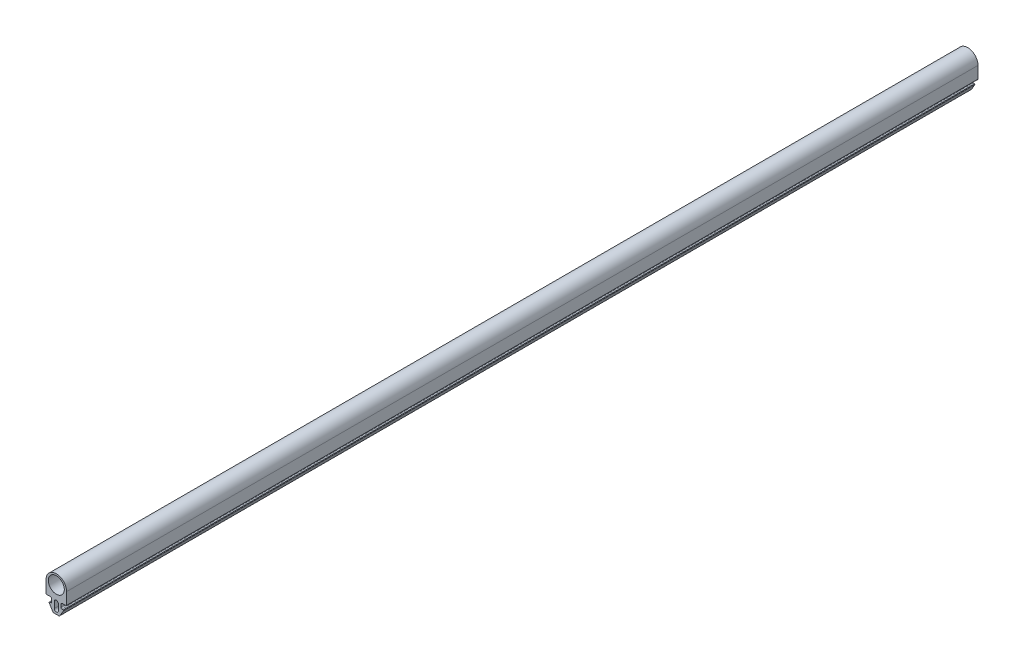
ISO-10303-21;
HEADER;
FILE_DESCRIPTION(('STEP AP214'),'2;1');
FILE_NAME('part.step','',(''),(''),'','','');
FILE_SCHEMA(('AUTOMOTIVE_DESIGN { 1 0 10303 214 1 1 1 1 }'));
ENDSEC;
DATA;
#1=APPLICATION_CONTEXT('core data for automotive mechanical design processes');
#2=APPLICATION_PROTOCOL_DEFINITION('international standard','automotive_design',2000,#1);
#3=PRODUCT_CONTEXT('',#1,'mechanical');
#4=PRODUCT('Part','Part','',(#3));
#5=PRODUCT_RELATED_PRODUCT_CATEGORY('part','',(#4));
#6=PRODUCT_DEFINITION_FORMATION('','',#4);
#7=PRODUCT_DEFINITION_CONTEXT('part definition',#1,'design');
#8=PRODUCT_DEFINITION('design','',#6,#7);
#9=PRODUCT_DEFINITION_SHAPE('','',#8);
#10=(LENGTH_UNIT() NAMED_UNIT(*) SI_UNIT(.MILLI.,.METRE.));
#11=(NAMED_UNIT(*) PLANE_ANGLE_UNIT() SI_UNIT($,.RADIAN.));
#12=(NAMED_UNIT(*) SI_UNIT($,.STERADIAN.) SOLID_ANGLE_UNIT());
#13=UNCERTAINTY_MEASURE_WITH_UNIT(LENGTH_MEASURE(1.E-05),#10,'distance_accuracy_value','');
#14=(GEOMETRIC_REPRESENTATION_CONTEXT(3) GLOBAL_UNCERTAINTY_ASSIGNED_CONTEXT((#13)) GLOBAL_UNIT_ASSIGNED_CONTEXT((#10,
#11,#12)) REPRESENTATION_CONTEXT('',''));
#15=CARTESIAN_POINT('',(0.,0.,0.));
#16=DIRECTION('',(0.,0.,1.));
#17=DIRECTION('',(1.,0.,0.));
#18=AXIS2_PLACEMENT_3D('',#15,#16,#17);
#19=CARTESIAN_POINT('',(1.89605275924265E-12,10.8645868639071,-776.));
#20=DIRECTION('',(0.,0.,1.));
#21=DIRECTION('',(1.,0.,0.));
#22=AXIS2_PLACEMENT_3D('',#19,#20,#21);
#23=CYLINDRICAL_SURFACE('',#22,8.99999999999883);
#24=CARTESIAN_POINT('',(1.89605275924265E-12,10.8645868639071,20.));
#25=DIRECTION('',(0.,0.,1.));
#26=DIRECTION('',(1.,0.,0.));
#27=AXIS2_PLACEMENT_3D('',#24,#25,#26);
#28=CIRCLE('',#27,8.99999999999883);
#29=CARTESIAN_POINT('',(9.00000000000078,10.8645868639071,20.));
#30=VERTEX_POINT('',#29);
#31=CARTESIAN_POINT('',(-8.99999999999688,10.8645868639071,20.));
#32=VERTEX_POINT('',#31);
#33=EDGE_CURVE('E245',#30,#32,#28,.T.);
#34=ORIENTED_EDGE('',*,*,#33,.F.);
#35=DIRECTION('',(0.,0.,1.));
#36=VECTOR('',#35,1.);
#37=CARTESIAN_POINT('',(9.00000000000078,10.8645868639071,-776.));
#38=LINE('',#37,#36);
#39=CARTESIAN_POINT('',(9.00000000000078,10.8645868639071,-776.));
#40=VERTEX_POINT('',#39);
#41=EDGE_CURVE('E11',#40,#30,#38,.T.);
#42=ORIENTED_EDGE('',*,*,#41,.F.);
#43=CARTESIAN_POINT('',(1.89605275924265E-12,10.8645868639071,-776.));
#44=DIRECTION('',(0.,0.,1.));
#45=DIRECTION('',(1.,0.,0.));
#46=AXIS2_PLACEMENT_3D('',#43,#44,#45);
#47=CIRCLE('',#46,8.99999999999883);
#48=CARTESIAN_POINT('',(-8.99999999999688,10.8645868639071,-776.));
#49=VERTEX_POINT('',#48);
#50=EDGE_CURVE('E249',#40,#49,#47,.T.);
#51=ORIENTED_EDGE('',*,*,#50,.T.);
#52=DIRECTION('',(0.,0.,1.));
#53=VECTOR('',#52,1.);
#54=CARTESIAN_POINT('',(-8.99999999999688,10.8645868639071,-776.));
#55=LINE('',#54,#53);
#56=EDGE_CURVE('E38',#49,#32,#55,.T.);
#57=ORIENTED_EDGE('',*,*,#56,.T.);
#58=EDGE_LOOP('',(#34,#42,#51,#57));
#59=FACE_BOUND('',#58,.T.);
#60=ADVANCED_FACE('F35',(#59),#23,.T.);
#61=CARTESIAN_POINT('',(9.00000000000088,0.52392483735149,-776.));
#62=DIRECTION('',(1.,0.,0.));
#63=DIRECTION('',(0.,1.,0.));
#64=AXIS2_PLACEMENT_3D('',#61,#62,#63);
#65=PLANE('',#64);
#66=DIRECTION('',(0.,1.,0.));
#67=VECTOR('',#66,1.);
#68=CARTESIAN_POINT('',(9.00000000000088,0.52392483735149,20.));
#69=LINE('',#68,#67);
#70=CARTESIAN_POINT('',(9.00000000000088,0.52392483735149,20.));
#71=VERTEX_POINT('',#70);
#72=EDGE_CURVE('E253',#71,#30,#69,.T.);
#73=ORIENTED_EDGE('',*,*,#72,.F.);
#74=DIRECTION('',(0.,0.,1.));
#75=VECTOR('',#74,1.);
#76=CARTESIAN_POINT('',(9.00000000000088,0.52392483735149,-776.));
#77=LINE('',#76,#75);
#78=CARTESIAN_POINT('',(9.00000000000088,0.52392483735149,-776.));
#79=VERTEX_POINT('',#78);
#80=EDGE_CURVE('E43',#79,#71,#77,.T.);
#81=ORIENTED_EDGE('',*,*,#80,.F.);
#82=DIRECTION('',(0.,1.,0.));
#83=VECTOR('',#82,1.);
#84=CARTESIAN_POINT('',(9.00000000000088,0.52392483735149,-776.));
#85=LINE('',#84,#83);
#86=EDGE_CURVE('E313',#79,#40,#85,.T.);
#87=ORIENTED_EDGE('',*,*,#86,.T.);
#88=ORIENTED_EDGE('',*,*,#41,.T.);
#89=EDGE_LOOP('',(#73,#81,#87,#88));
#90=FACE_BOUND('',#89,.T.);
#91=ADVANCED_FACE('F430',(#90),#65,.T.);
#92=CARTESIAN_POINT('',(8.50059730669664,0.499492278712887,-776.));
#93=DIRECTION('',(0.,0.,1.));
#94=DIRECTION('',(1.,0.,0.));
#95=AXIS2_PLACEMENT_3D('',#92,#93,#94);
#96=CYLINDRICAL_SURFACE('',#95,0.50000000000115);
#97=CARTESIAN_POINT('',(8.50059730669664,0.499492278712887,20.));
#98=DIRECTION('',(0.,0.,1.));
#99=DIRECTION('',(1.,0.,0.));
#100=AXIS2_PLACEMENT_3D('',#97,#98,#99);
#101=CIRCLE('',#100,0.50000000000115);
#102=CARTESIAN_POINT('',(8.47807035601008,-1.22623265708111E-13,20.));
#103=VERTEX_POINT('',#102);
#104=EDGE_CURVE('E375',#103,#71,#101,.T.);
#105=ORIENTED_EDGE('',*,*,#104,.F.);
#106=DIRECTION('',(0.,0.,1.));
#107=VECTOR('',#106,1.);
#108=CARTESIAN_POINT('',(8.47807035601008,-1.22623265708111E-13,-776.));
#109=LINE('',#108,#107);
#110=CARTESIAN_POINT('',(8.47807035601008,-1.22623265708111E-13,-776.));
#111=VERTEX_POINT('',#110);
#112=EDGE_CURVE('E381',#111,#103,#109,.T.);
#113=ORIENTED_EDGE('',*,*,#112,.F.);
#114=CARTESIAN_POINT('',(8.50059730669664,0.499492278712887,-776.));
#115=DIRECTION('',(0.,0.,1.));
#116=DIRECTION('',(1.,0.,0.));
#117=AXIS2_PLACEMENT_3D('',#114,#115,#116);
#118=CIRCLE('',#117,0.50000000000115);
#119=EDGE_CURVE('E310',#111,#79,#118,.T.);
#120=ORIENTED_EDGE('',*,*,#119,.T.);
#121=ORIENTED_EDGE('',*,*,#80,.T.);
#122=EDGE_LOOP('',(#105,#113,#120,#121));
#123=FACE_BOUND('',#122,.T.);
#124=ADVANCED_FACE('F505',(#123),#96,.T.);
#125=CARTESIAN_POINT('',(5.49999999999965,-1.15033850500712E-13,-776.));
#126=DIRECTION('',(0.,-1.,0.));
#127=DIRECTION('',(1.,0.,0.));
#128=AXIS2_PLACEMENT_3D('',#125,#126,#127);
#129=PLANE('',#128);
#130=DIRECTION('',(1.,0.,0.));
#131=VECTOR('',#130,1.);
#132=CARTESIAN_POINT('',(5.49999999999965,-1.15033850500712E-13,20.));
#133=LINE('',#132,#131);
#134=CARTESIAN_POINT('',(5.49999999999965,-1.15033850500712E-13,20.));
#135=VERTEX_POINT('',#134);
#136=EDGE_CURVE('E372',#135,#103,#133,.T.);
#137=ORIENTED_EDGE('',*,*,#136,.F.);
#138=DIRECTION('',(0.,0.,1.));
#139=VECTOR('',#138,1.);
#140=CARTESIAN_POINT('',(5.49999999999965,-1.15033850500712E-13,-776.));
#141=LINE('',#140,#139);
#142=CARTESIAN_POINT('',(5.49999999999965,-1.15033850500712E-13,-776.));
#143=VERTEX_POINT('',#142);
#144=EDGE_CURVE('E383',#143,#135,#141,.T.);
#145=ORIENTED_EDGE('',*,*,#144,.F.);
#146=DIRECTION('',(1.,0.,0.));
#147=VECTOR('',#146,1.);
#148=CARTESIAN_POINT('',(5.49999999999965,-1.15033850500712E-13,-776.));
#149=LINE('',#148,#147);
#150=EDGE_CURVE('E307',#143,#111,#149,.T.);
#151=ORIENTED_EDGE('',*,*,#150,.T.);
#152=ORIENTED_EDGE('',*,*,#112,.T.);
#153=EDGE_LOOP('',(#137,#145,#151,#152));
#154=FACE_BOUND('',#153,.T.);
#155=ADVANCED_FACE('F503',(#154),#129,.T.);
#156=CARTESIAN_POINT('',(5.49999999999963,-1.50000000000017,-776.));
#157=DIRECTION('',(0.,0.,1.));
#158=DIRECTION('',(1.,0.,0.));
#159=AXIS2_PLACEMENT_3D('',#156,#157,#158);
#160=CYLINDRICAL_SURFACE('',#159,1.50000000000001);
#161=CARTESIAN_POINT('',(5.49999999999963,-1.50000000000017,20.));
#162=DIRECTION('',(0.,0.,-1.));
#163=DIRECTION('',(-1.,0.,0.));
#164=AXIS2_PLACEMENT_3D('',#161,#162,#163);
#165=CIRCLE('',#164,1.50000000000001);
#166=CARTESIAN_POINT('',(3.99999999999962,-1.50000000000015,20.));
#167=VERTEX_POINT('',#166);
#168=EDGE_CURVE('E369',#167,#135,#165,.T.);
#169=ORIENTED_EDGE('',*,*,#168,.F.);
#170=DIRECTION('',(0.,0.,1.));
#171=VECTOR('',#170,1.);
#172=CARTESIAN_POINT('',(3.99999999999962,-1.50000000000015,-776.));
#173=LINE('',#172,#171);
#174=CARTESIAN_POINT('',(3.99999999999962,-1.50000000000015,-776.));
#175=VERTEX_POINT('',#174);
#176=EDGE_CURVE('E385',#175,#167,#173,.T.);
#177=ORIENTED_EDGE('',*,*,#176,.F.);
#178=CARTESIAN_POINT('',(5.49999999999963,-1.50000000000017,-776.));
#179=DIRECTION('',(0.,0.,-1.));
#180=DIRECTION('',(-1.,0.,0.));
#181=AXIS2_PLACEMENT_3D('',#178,#179,#180);
#182=CIRCLE('',#181,1.50000000000001);
#183=EDGE_CURVE('E304',#175,#143,#182,.T.);
#184=ORIENTED_EDGE('',*,*,#183,.T.);
#185=ORIENTED_EDGE('',*,*,#144,.T.);
#186=EDGE_LOOP('',(#169,#177,#184,#185));
#187=FACE_BOUND('',#186,.T.);
#188=ADVANCED_FACE('F499',(#187),#160,.F.);
#189=CARTESIAN_POINT('',(3.9999999999997,-3.49999999999885,-776.));
#190=DIRECTION('',(1.,0.,0.));
#191=DIRECTION('',(0.,1.,0.));
#192=AXIS2_PLACEMENT_3D('',#189,#190,#191);
#193=PLANE('',#192);
#194=DIRECTION('',(0.,1.,0.));
#195=VECTOR('',#194,1.);
#196=CARTESIAN_POINT('',(3.9999999999997,-3.49999999999885,20.));
#197=LINE('',#196,#195);
#198=CARTESIAN_POINT('',(3.9999999999997,-3.49999999999885,20.));
#199=VERTEX_POINT('',#198);
#200=EDGE_CURVE('E366',#199,#167,#197,.T.);
#201=ORIENTED_EDGE('',*,*,#200,.F.);
#202=DIRECTION('',(0.,0.,1.));
#203=VECTOR('',#202,1.);
#204=CARTESIAN_POINT('',(3.9999999999997,-3.49999999999885,-776.));
#205=LINE('',#204,#203);
#206=CARTESIAN_POINT('',(3.9999999999997,-3.49999999999885,-776.));
#207=VERTEX_POINT('',#206);
#208=EDGE_CURVE('E387',#207,#199,#205,.T.);
#209=ORIENTED_EDGE('',*,*,#208,.F.);
#210=DIRECTION('',(0.,1.,0.));
#211=VECTOR('',#210,1.);
#212=CARTESIAN_POINT('',(3.9999999999997,-3.49999999999885,-776.));
#213=LINE('',#212,#211);
#214=EDGE_CURVE('E301',#207,#175,#213,.T.);
#215=ORIENTED_EDGE('',*,*,#214,.T.);
#216=ORIENTED_EDGE('',*,*,#176,.T.);
#217=EDGE_LOOP('',(#201,#209,#215,#216));
#218=FACE_BOUND('',#217,.T.);
#219=ADVANCED_FACE('F495',(#218),#193,.T.);
#220=CARTESIAN_POINT('',(4.9999999999997,-3.49999999999885,-776.));
#221=DIRECTION('',(0.,0.,1.));
#222=DIRECTION('',(1.,0.,0.));
#223=AXIS2_PLACEMENT_3D('',#220,#221,#222);
#224=CYLINDRICAL_SURFACE('',#223,1.);
#225=CARTESIAN_POINT('',(4.9999999999997,-3.49999999999885,20.));
#226=DIRECTION('',(0.,0.,-1.));
#227=DIRECTION('',(-1.,0.,0.));
#228=AXIS2_PLACEMENT_3D('',#225,#226,#227);
#229=CIRCLE('',#228,1.);
#230=CARTESIAN_POINT('',(4.9999999999997,-4.49999999999885,20.));
#231=VERTEX_POINT('',#230);
#232=EDGE_CURVE('E363',#231,#199,#229,.T.);
#233=ORIENTED_EDGE('',*,*,#232,.F.);
#234=DIRECTION('',(0.,0.,1.));
#235=VECTOR('',#234,1.);
#236=CARTESIAN_POINT('',(4.9999999999997,-4.49999999999885,-776.));
#237=LINE('',#236,#235);
#238=CARTESIAN_POINT('',(4.9999999999997,-4.49999999999885,-776.));
#239=VERTEX_POINT('',#238);
#240=EDGE_CURVE('E389',#239,#231,#237,.T.);
#241=ORIENTED_EDGE('',*,*,#240,.F.);
#242=CARTESIAN_POINT('',(4.9999999999997,-3.49999999999885,-776.));
#243=DIRECTION('',(0.,0.,-1.));
#244=DIRECTION('',(-1.,0.,0.));
#245=AXIS2_PLACEMENT_3D('',#242,#243,#244);
#246=CIRCLE('',#245,1.);
#247=EDGE_CURVE('E298',#239,#207,#246,.T.);
#248=ORIENTED_EDGE('',*,*,#247,.T.);
#249=ORIENTED_EDGE('',*,*,#208,.T.);
#250=EDGE_LOOP('',(#233,#241,#248,#249));
#251=FACE_BOUND('',#250,.T.);
#252=ADVANCED_FACE('F491',(#251),#224,.F.);
#253=CARTESIAN_POINT('',(6.0160076135011,-4.49999999999891,-776.));
#254=DIRECTION('',(0.,1.,0.));
#255=DIRECTION('',(-1.,0.,0.));
#256=AXIS2_PLACEMENT_3D('',#253,#254,#255);
#257=PLANE('',#256);
#258=DIRECTION('',(-1.,0.,0.));
#259=VECTOR('',#258,1.);
#260=CARTESIAN_POINT('',(6.0160076135011,-4.49999999999891,20.));
#261=LINE('',#260,#259);
#262=CARTESIAN_POINT('',(6.0160076135011,-4.49999999999891,20.));
#263=VERTEX_POINT('',#262);
#264=EDGE_CURVE('E360',#263,#231,#261,.T.);
#265=ORIENTED_EDGE('',*,*,#264,.F.);
#266=DIRECTION('',(0.,0.,1.));
#267=VECTOR('',#266,1.);
#268=CARTESIAN_POINT('',(6.0160076135011,-4.49999999999891,-776.));
#269=LINE('',#268,#267);
#270=CARTESIAN_POINT('',(6.0160076135011,-4.49999999999891,-776.));
#271=VERTEX_POINT('',#270);
#272=EDGE_CURVE('E391',#271,#263,#269,.T.);
#273=ORIENTED_EDGE('',*,*,#272,.F.);
#274=DIRECTION('',(-1.,0.,0.));
#275=VECTOR('',#274,1.);
#276=CARTESIAN_POINT('',(6.0160076135011,-4.49999999999891,-776.));
#277=LINE('',#276,#275);
#278=EDGE_CURVE('E295',#271,#239,#277,.T.);
#279=ORIENTED_EDGE('',*,*,#278,.T.);
#280=ORIENTED_EDGE('',*,*,#240,.T.);
#281=EDGE_LOOP('',(#265,#273,#279,#280));
#282=FACE_BOUND('',#281,.T.);
#283=ADVANCED_FACE('F487',(#282),#257,.T.);
#284=CARTESIAN_POINT('',(5.7411809549003,-4.91769643010379,-776.));
#285=DIRECTION('',(0.,0.,1.));
#286=DIRECTION('',(1.,0.,0.));
#287=AXIS2_PLACEMENT_3D('',#284,#285,#286);
#288=CYLINDRICAL_SURFACE('',#287,0.50000000000003);
#289=CARTESIAN_POINT('',(5.7411809549003,-4.91769643010379,20.));
#290=DIRECTION('',(0.,0.,1.));
#291=DIRECTION('',(1.,0.,0.));
#292=AXIS2_PLACEMENT_3D('',#289,#290,#291);
#293=CIRCLE('',#292,0.50000000000003);
#294=CARTESIAN_POINT('',(6.17419365679255,-5.1676964301038,20.));
#295=VERTEX_POINT('',#294);
#296=EDGE_CURVE('E357',#295,#263,#293,.T.);
#297=ORIENTED_EDGE('',*,*,#296,.F.);
#298=DIRECTION('',(0.,0.,1.));
#299=VECTOR('',#298,1.);
#300=CARTESIAN_POINT('',(6.17419365679255,-5.1676964301038,-776.));
#301=LINE('',#300,#299);
#302=CARTESIAN_POINT('',(6.17419365679255,-5.1676964301038,-776.));
#303=VERTEX_POINT('',#302);
#304=EDGE_CURVE('E393',#303,#295,#301,.T.);
#305=ORIENTED_EDGE('',*,*,#304,.F.);
#306=CARTESIAN_POINT('',(5.7411809549003,-4.91769643010379,-776.));
#307=DIRECTION('',(0.,0.,1.));
#308=DIRECTION('',(1.,0.,0.));
#309=AXIS2_PLACEMENT_3D('',#306,#307,#308);
#310=CIRCLE('',#309,0.50000000000003);
#311=EDGE_CURVE('E292',#303,#271,#310,.T.);
#312=ORIENTED_EDGE('',*,*,#311,.T.);
#313=ORIENTED_EDGE('',*,*,#272,.T.);
#314=EDGE_LOOP('',(#297,#305,#312,#313));
#315=FACE_BOUND('',#314,.T.);
#316=ADVANCED_FACE('F483',(#315),#288,.T.);
#317=CARTESIAN_POINT('',(3.44004357329789,-9.90338329023524,-776.));
#318=DIRECTION('',(0.866025403784439,-0.5,0.));
#319=DIRECTION('',(0.5,0.866025403784439,0.));
#320=AXIS2_PLACEMENT_3D('',#317,#318,#319);
#321=PLANE('',#320);
#322=DIRECTION('',(0.5,0.866025403784439,0.));
#323=VECTOR('',#322,1.);
#324=CARTESIAN_POINT('',(3.44004357329789,-9.90338329023524,20.));
#325=LINE('',#324,#323);
#326=CARTESIAN_POINT('',(3.44004357329789,-9.90338329023524,20.));
#327=VERTEX_POINT('',#326);
#328=EDGE_CURVE('E354',#327,#295,#325,.T.);
#329=ORIENTED_EDGE('',*,*,#328,.F.);
#330=DIRECTION('',(0.,0.,1.));
#331=VECTOR('',#330,1.);
#332=CARTESIAN_POINT('',(3.44004357329789,-9.90338329023524,-776.));
#333=LINE('',#332,#331);
#334=CARTESIAN_POINT('',(3.44004357329789,-9.90338329023524,-776.));
#335=VERTEX_POINT('',#334);
#336=EDGE_CURVE('E395',#335,#327,#333,.T.);
#337=ORIENTED_EDGE('',*,*,#336,.F.);
#338=DIRECTION('',(0.5,0.866025403784439,0.));
#339=VECTOR('',#338,1.);
#340=CARTESIAN_POINT('',(3.44004357329789,-9.90338329023524,-776.));
#341=LINE('',#340,#339);
#342=EDGE_CURVE('E289',#335,#303,#341,.T.);
#343=ORIENTED_EDGE('',*,*,#342,.T.);
#344=ORIENTED_EDGE('',*,*,#304,.T.);
#345=EDGE_LOOP('',(#329,#337,#343,#344));
#346=FACE_BOUND('',#345,.T.);
#347=ADVANCED_FACE('F479',(#346),#321,.T.);
#348=CARTESIAN_POINT('',(1.70799276572915,-8.90338329023532,-776.));
#349=DIRECTION('',(0.,0.,1.));
#350=DIRECTION('',(1.,0.,0.));
#351=AXIS2_PLACEMENT_3D('',#348,#349,#350);
#352=CYLINDRICAL_SURFACE('',#351,1.99999999999984);
#353=CARTESIAN_POINT('',(1.70799276572915,-8.90338329023532,20.));
#354=DIRECTION('',(0.,0.,1.));
#355=DIRECTION('',(1.,0.,0.));
#356=AXIS2_PLACEMENT_3D('',#353,#354,#355);
#357=CIRCLE('',#356,1.99999999999984);
#358=CARTESIAN_POINT('',(1.70799276572915,-10.9033832902352,20.));
#359=VERTEX_POINT('',#358);
#360=EDGE_CURVE('E351',#359,#327,#357,.T.);
#361=ORIENTED_EDGE('',*,*,#360,.F.);
#362=DIRECTION('',(0.,0.,1.));
#363=VECTOR('',#362,1.);
#364=CARTESIAN_POINT('',(1.70799276572915,-10.9033832902352,-776.));
#365=LINE('',#364,#363);
#366=CARTESIAN_POINT('',(1.70799276572915,-10.9033832902352,-776.));
#367=VERTEX_POINT('',#366);
#368=EDGE_CURVE('E397',#367,#359,#365,.T.);
#369=ORIENTED_EDGE('',*,*,#368,.F.);
#370=CARTESIAN_POINT('',(1.70799276572915,-8.90338329023532,-776.));
#371=DIRECTION('',(0.,0.,1.));
#372=DIRECTION('',(1.,0.,0.));
#373=AXIS2_PLACEMENT_3D('',#370,#371,#372);
#374=CIRCLE('',#373,1.99999999999984);
#375=EDGE_CURVE('E286',#367,#335,#374,.T.);
#376=ORIENTED_EDGE('',*,*,#375,.T.);
#377=ORIENTED_EDGE('',*,*,#336,.T.);
#378=EDGE_LOOP('',(#361,#369,#376,#377));
#379=FACE_BOUND('',#378,.T.);
#380=ADVANCED_FACE('F475',(#379),#352,.T.);
#381=CARTESIAN_POINT('',(-1.70799276572332,-10.9033832902352,-776.));
#382=DIRECTION('',(0.,-1.,0.));
#383=DIRECTION('',(1.,0.,0.));
#384=AXIS2_PLACEMENT_3D('',#381,#382,#383);
#385=PLANE('',#384);
#386=DIRECTION('',(1.,0.,0.));
#387=VECTOR('',#386,1.);
#388=CARTESIAN_POINT('',(-1.70799276572332,-10.9033832902352,20.));
#389=LINE('',#388,#387);
#390=CARTESIAN_POINT('',(-1.70799276572332,-10.9033832902352,20.));
#391=VERTEX_POINT('',#390);
#392=EDGE_CURVE('E348',#391,#359,#389,.T.);
#393=ORIENTED_EDGE('',*,*,#392,.F.);
#394=DIRECTION('',(0.,0.,1.));
#395=VECTOR('',#394,1.);
#396=CARTESIAN_POINT('',(-1.70799276572332,-10.9033832902352,-776.));
#397=LINE('',#396,#395);
#398=CARTESIAN_POINT('',(-1.70799276572332,-10.9033832902352,-776.));
#399=VERTEX_POINT('',#398);
#400=EDGE_CURVE('E399',#399,#391,#397,.T.);
#401=ORIENTED_EDGE('',*,*,#400,.F.);
#402=DIRECTION('',(1.,0.,0.));
#403=VECTOR('',#402,1.);
#404=CARTESIAN_POINT('',(-1.70799276572332,-10.9033832902352,-776.));
#405=LINE('',#404,#403);
#406=EDGE_CURVE('E283',#399,#367,#405,.T.);
#407=ORIENTED_EDGE('',*,*,#406,.T.);
#408=ORIENTED_EDGE('',*,*,#368,.T.);
#409=EDGE_LOOP('',(#393,#401,#407,#408));
#410=FACE_BOUND('',#409,.T.);
#411=ADVANCED_FACE('F471',(#410),#385,.T.);
#412=CARTESIAN_POINT('',(-1.70799276572332,-8.90338329023573,-776.));
#413=DIRECTION('',(0.,0.,1.));
#414=DIRECTION('',(1.,0.,0.));
#415=AXIS2_PLACEMENT_3D('',#412,#413,#414);
#416=CYLINDRICAL_SURFACE('',#415,1.99999999999943);
#417=CARTESIAN_POINT('',(-1.70799276572332,-8.90338329023573,20.));
#418=DIRECTION('',(0.,0.,1.));
#419=DIRECTION('',(1.,0.,0.));
#420=AXIS2_PLACEMENT_3D('',#417,#418,#419);
#421=CIRCLE('',#420,1.99999999999943);
#422=CARTESIAN_POINT('',(-3.44004357329171,-9.90338329023544,20.));
#423=VERTEX_POINT('',#422);
#424=EDGE_CURVE('E345',#423,#391,#421,.T.);
#425=ORIENTED_EDGE('',*,*,#424,.F.);
#426=DIRECTION('',(0.,0.,1.));
#427=VECTOR('',#426,1.);
#428=CARTESIAN_POINT('',(-3.44004357329171,-9.90338329023544,-776.));
#429=LINE('',#428,#427);
#430=CARTESIAN_POINT('',(-3.44004357329171,-9.90338329023544,-776.));
#431=VERTEX_POINT('',#430);
#432=EDGE_CURVE('E401',#431,#423,#429,.T.);
#433=ORIENTED_EDGE('',*,*,#432,.F.);
#434=CARTESIAN_POINT('',(-1.70799276572332,-8.90338329023573,-776.));
#435=DIRECTION('',(0.,0.,1.));
#436=DIRECTION('',(1.,0.,0.));
#437=AXIS2_PLACEMENT_3D('',#434,#435,#436);
#438=CIRCLE('',#437,1.99999999999943);
#439=EDGE_CURVE('E280',#431,#399,#438,.T.);
#440=ORIENTED_EDGE('',*,*,#439,.T.);
#441=ORIENTED_EDGE('',*,*,#400,.T.);
#442=EDGE_LOOP('',(#425,#433,#440,#441));
#443=FACE_BOUND('',#442,.T.);
#444=ADVANCED_FACE('F467',(#443),#416,.T.);
#445=CARTESIAN_POINT('',(-6.17419365678656,-5.16769643010366,-776.));
#446=DIRECTION('',(-0.866025403784438,-0.5,0.));
#447=DIRECTION('',(0.5,-0.866025403784439,0.));
#448=AXIS2_PLACEMENT_3D('',#445,#446,#447);
#449=PLANE('',#448);
#450=DIRECTION('',(0.5,-0.866025403784439,0.));
#451=VECTOR('',#450,1.);
#452=CARTESIAN_POINT('',(-6.17419365678656,-5.16769643010366,20.));
#453=LINE('',#452,#451);
#454=CARTESIAN_POINT('',(-6.17419365678656,-5.16769643010366,20.));
#455=VERTEX_POINT('',#454);
#456=EDGE_CURVE('E342',#455,#423,#453,.T.);
#457=ORIENTED_EDGE('',*,*,#456,.F.);
#458=DIRECTION('',(0.,0.,1.));
#459=VECTOR('',#458,1.);
#460=CARTESIAN_POINT('',(-6.17419365678656,-5.16769643010366,-776.));
#461=LINE('',#460,#459);
#462=CARTESIAN_POINT('',(-6.17419365678656,-5.16769643010366,-776.));
#463=VERTEX_POINT('',#462);
#464=EDGE_CURVE('E403',#463,#455,#461,.T.);
#465=ORIENTED_EDGE('',*,*,#464,.F.);
#466=DIRECTION('',(0.5,-0.866025403784439,0.));
#467=VECTOR('',#466,1.);
#468=CARTESIAN_POINT('',(-6.17419365678656,-5.16769643010366,-776.));
#469=LINE('',#468,#467);
#470=EDGE_CURVE('E277',#463,#431,#469,.T.);
#471=ORIENTED_EDGE('',*,*,#470,.T.);
#472=ORIENTED_EDGE('',*,*,#432,.T.);
#473=EDGE_LOOP('',(#457,#465,#471,#472));
#474=FACE_BOUND('',#473,.T.);
#475=ADVANCED_FACE('F463',(#474),#449,.T.);
#476=CARTESIAN_POINT('',(-5.74118095489438,-4.91769643010368,-776.));
#477=DIRECTION('',(0.,0.,1.));
#478=DIRECTION('',(1.,0.,0.));
#479=AXIS2_PLACEMENT_3D('',#476,#477,#478);
#480=CYLINDRICAL_SURFACE('',#479,0.499999999999964);
#481=CARTESIAN_POINT('',(-5.74118095489438,-4.91769643010368,20.));
#482=DIRECTION('',(0.,0.,1.));
#483=DIRECTION('',(1.,0.,0.));
#484=AXIS2_PLACEMENT_3D('',#481,#482,#483);
#485=CIRCLE('',#484,0.499999999999964);
#486=CARTESIAN_POINT('',(-6.01600761349511,-4.49999999999885,20.));
#487=VERTEX_POINT('',#486);
#488=EDGE_CURVE('E339',#487,#455,#485,.T.);
#489=ORIENTED_EDGE('',*,*,#488,.F.);
#490=DIRECTION('',(0.,0.,1.));
#491=VECTOR('',#490,1.);
#492=CARTESIAN_POINT('',(-6.01600761349511,-4.49999999999885,-776.));
#493=LINE('',#492,#491);
#494=CARTESIAN_POINT('',(-6.01600761349511,-4.49999999999885,-776.));
#495=VERTEX_POINT('',#494);
#496=EDGE_CURVE('E405',#495,#487,#493,.T.);
#497=ORIENTED_EDGE('',*,*,#496,.F.);
#498=CARTESIAN_POINT('',(-5.74118095489438,-4.91769643010368,-776.));
#499=DIRECTION('',(0.,0.,1.));
#500=DIRECTION('',(1.,0.,0.));
#501=AXIS2_PLACEMENT_3D('',#498,#499,#500);
#502=CIRCLE('',#501,0.499999999999964);
#503=EDGE_CURVE('E274',#495,#463,#502,.T.);
#504=ORIENTED_EDGE('',*,*,#503,.T.);
#505=ORIENTED_EDGE('',*,*,#464,.T.);
#506=EDGE_LOOP('',(#489,#497,#504,#505));
#507=FACE_BOUND('',#506,.T.);
#508=ADVANCED_FACE('F459',(#507),#480,.T.);
#509=CARTESIAN_POINT('',(-4.99999999999678,-4.49999999999885,-776.));
#510=DIRECTION('',(0.,1.,0.));
#511=DIRECTION('',(-1.,0.,0.));
#512=AXIS2_PLACEMENT_3D('',#509,#510,#511);
#513=PLANE('',#512);
#514=DIRECTION('',(-1.,0.,0.));
#515=VECTOR('',#514,1.);
#516=CARTESIAN_POINT('',(-4.99999999999678,-4.49999999999885,20.));
#517=LINE('',#516,#515);
#518=CARTESIAN_POINT('',(-4.99999999999678,-4.49999999999885,20.));
#519=VERTEX_POINT('',#518);
#520=EDGE_CURVE('E336',#519,#487,#517,.T.);
#521=ORIENTED_EDGE('',*,*,#520,.F.);
#522=DIRECTION('',(0.,0.,1.));
#523=VECTOR('',#522,1.);
#524=CARTESIAN_POINT('',(-4.99999999999678,-4.49999999999885,-776.));
#525=LINE('',#524,#523);
#526=CARTESIAN_POINT('',(-4.99999999999678,-4.49999999999885,-776.));
#527=VERTEX_POINT('',#526);
#528=EDGE_CURVE('E407',#527,#519,#525,.T.);
#529=ORIENTED_EDGE('',*,*,#528,.F.);
#530=DIRECTION('',(-1.,0.,0.));
#531=VECTOR('',#530,1.);
#532=CARTESIAN_POINT('',(-4.99999999999678,-4.49999999999885,-776.));
#533=LINE('',#532,#531);
#534=EDGE_CURVE('E271',#527,#495,#533,.T.);
#535=ORIENTED_EDGE('',*,*,#534,.T.);
#536=ORIENTED_EDGE('',*,*,#496,.T.);
#537=EDGE_LOOP('',(#521,#529,#535,#536));
#538=FACE_BOUND('',#537,.T.);
#539=ADVANCED_FACE('F455',(#538),#513,.T.);
#540=CARTESIAN_POINT('',(-4.99999999999675,-3.49999999999889,-776.));
#541=DIRECTION('',(0.,0.,1.));
#542=DIRECTION('',(1.,0.,0.));
#543=AXIS2_PLACEMENT_3D('',#540,#541,#542);
#544=CYLINDRICAL_SURFACE('',#543,0.999999999999959);
#545=CARTESIAN_POINT('',(-4.99999999999675,-3.49999999999889,20.));
#546=DIRECTION('',(0.,0.,-1.));
#547=DIRECTION('',(-1.,0.,0.));
#548=AXIS2_PLACEMENT_3D('',#545,#546,#547);
#549=CIRCLE('',#548,0.999999999999959);
#550=CARTESIAN_POINT('',(-3.99999999999679,-3.49999999999889,20.));
#551=VERTEX_POINT('',#550);
#552=EDGE_CURVE('E333',#551,#519,#549,.T.);
#553=ORIENTED_EDGE('',*,*,#552,.F.);
#554=DIRECTION('',(0.,0.,1.));
#555=VECTOR('',#554,1.);
#556=CARTESIAN_POINT('',(-3.99999999999679,-3.49999999999889,-776.));
#557=LINE('',#556,#555);
#558=CARTESIAN_POINT('',(-3.99999999999679,-3.49999999999889,-776.));
#559=VERTEX_POINT('',#558);
#560=EDGE_CURVE('E409',#559,#551,#557,.T.);
#561=ORIENTED_EDGE('',*,*,#560,.F.);
#562=CARTESIAN_POINT('',(-4.99999999999675,-3.49999999999889,-776.));
#563=DIRECTION('',(0.,0.,-1.));
#564=DIRECTION('',(-1.,0.,0.));
#565=AXIS2_PLACEMENT_3D('',#562,#563,#564);
#566=CIRCLE('',#565,0.999999999999959);
#567=EDGE_CURVE('E268',#559,#527,#566,.T.);
#568=ORIENTED_EDGE('',*,*,#567,.T.);
#569=ORIENTED_EDGE('',*,*,#528,.T.);
#570=EDGE_LOOP('',(#553,#561,#568,#569));
#571=FACE_BOUND('',#570,.T.);
#572=ADVANCED_FACE('F451',(#571),#544,.F.);
#573=CARTESIAN_POINT('',(-3.99999999999679,-1.49999999999903,-776.));
#574=DIRECTION('',(-1.,0.,0.));
#575=DIRECTION('',(0.,-1.,0.));
#576=AXIS2_PLACEMENT_3D('',#573,#574,#575);
#577=PLANE('',#576);
#578=DIRECTION('',(0.,-1.,0.));
#579=VECTOR('',#578,1.);
#580=CARTESIAN_POINT('',(-3.99999999999679,-1.49999999999903,20.));
#581=LINE('',#580,#579);
#582=CARTESIAN_POINT('',(-3.99999999999679,-1.49999999999903,20.));
#583=VERTEX_POINT('',#582);
#584=EDGE_CURVE('E330',#583,#551,#581,.T.);
#585=ORIENTED_EDGE('',*,*,#584,.F.);
#586=DIRECTION('',(0.,0.,1.));
#587=VECTOR('',#586,1.);
#588=CARTESIAN_POINT('',(-3.99999999999679,-1.49999999999903,-776.));
#589=LINE('',#588,#587);
#590=CARTESIAN_POINT('',(-3.99999999999679,-1.49999999999903,-776.));
#591=VERTEX_POINT('',#590);
#592=EDGE_CURVE('E411',#591,#583,#589,.T.);
#593=ORIENTED_EDGE('',*,*,#592,.F.);
#594=DIRECTION('',(0.,-1.,0.));
#595=VECTOR('',#594,1.);
#596=CARTESIAN_POINT('',(-3.99999999999679,-1.49999999999903,-776.));
#597=LINE('',#596,#595);
#598=EDGE_CURVE('E265',#591,#559,#597,.T.);
#599=ORIENTED_EDGE('',*,*,#598,.T.);
#600=ORIENTED_EDGE('',*,*,#560,.T.);
#601=EDGE_LOOP('',(#585,#593,#599,#600));
#602=FACE_BOUND('',#601,.T.);
#603=ADVANCED_FACE('F447',(#602),#577,.T.);
#604=CARTESIAN_POINT('',(-5.4999999999957,-1.49999999999903,-776.));
#605=DIRECTION('',(0.,0.,1.));
#606=DIRECTION('',(1.,0.,0.));
#607=AXIS2_PLACEMENT_3D('',#604,#605,#606);
#608=CYLINDRICAL_SURFACE('',#607,1.49999999999892);
#609=CARTESIAN_POINT('',(-5.4999999999957,-1.49999999999903,20.));
#610=DIRECTION('',(0.,0.,-1.));
#611=DIRECTION('',(-1.,0.,0.));
#612=AXIS2_PLACEMENT_3D('',#609,#610,#611);
#613=CIRCLE('',#612,1.49999999999892);
#614=CARTESIAN_POINT('',(-5.4999999999957,-1.13841228110978E-13,20.));
#615=VERTEX_POINT('',#614);
#616=EDGE_CURVE('E327',#615,#583,#613,.T.);
#617=ORIENTED_EDGE('',*,*,#616,.F.);
#618=DIRECTION('',(0.,0.,1.));
#619=VECTOR('',#618,1.);
#620=CARTESIAN_POINT('',(-5.4999999999957,-1.13841228110978E-13,-776.));
#621=LINE('',#620,#619);
#622=CARTESIAN_POINT('',(-5.4999999999957,-1.13841228110978E-13,-776.));
#623=VERTEX_POINT('',#622);
#624=EDGE_CURVE('E413',#623,#615,#621,.T.);
#625=ORIENTED_EDGE('',*,*,#624,.F.);
#626=CARTESIAN_POINT('',(-5.4999999999957,-1.49999999999903,-776.));
#627=DIRECTION('',(0.,0.,-1.));
#628=DIRECTION('',(-1.,0.,0.));
#629=AXIS2_PLACEMENT_3D('',#626,#627,#628);
#630=CIRCLE('',#629,1.49999999999892);
#631=EDGE_CURVE('E262',#623,#591,#630,.T.);
#632=ORIENTED_EDGE('',*,*,#631,.T.);
#633=ORIENTED_EDGE('',*,*,#592,.T.);
#634=EDGE_LOOP('',(#617,#625,#632,#633));
#635=FACE_BOUND('',#634,.T.);
#636=ADVANCED_FACE('F443',(#635),#608,.F.);
#637=CARTESIAN_POINT('',(-8.47807035600795,-1.25821662116943E-13,-776.));
#638=DIRECTION('',(0.,-1.,0.));
#639=DIRECTION('',(1.,0.,0.));
#640=AXIS2_PLACEMENT_3D('',#637,#638,#639);
#641=PLANE('',#640);
#642=DIRECTION('',(1.,0.,0.));
#643=VECTOR('',#642,1.);
#644=CARTESIAN_POINT('',(-8.47807035600795,-1.25821662116943E-13,20.));
#645=LINE('',#644,#643);
#646=CARTESIAN_POINT('',(-8.47807035600795,-1.25821662116943E-13,20.));
#647=VERTEX_POINT('',#646);
#648=EDGE_CURVE('E324',#647,#615,#645,.T.);
#649=ORIENTED_EDGE('',*,*,#648,.F.);
#650=DIRECTION('',(0.,0.,1.));
#651=VECTOR('',#650,1.);
#652=CARTESIAN_POINT('',(-8.47807035600795,-1.25821662116943E-13,-776.));
#653=LINE('',#652,#651);
#654=CARTESIAN_POINT('',(-8.47807035600795,-1.25821662116943E-13,-776.));
#655=VERTEX_POINT('',#654);
#656=EDGE_CURVE('E415',#655,#647,#653,.T.);
#657=ORIENTED_EDGE('',*,*,#656,.F.);
#658=DIRECTION('',(1.,0.,0.));
#659=VECTOR('',#658,1.);
#660=CARTESIAN_POINT('',(-8.47807035600795,-1.25821662116943E-13,-776.));
#661=LINE('',#660,#659);
#662=EDGE_CURVE('E259',#655,#623,#661,.T.);
#663=ORIENTED_EDGE('',*,*,#662,.T.);
#664=ORIENTED_EDGE('',*,*,#624,.T.);
#665=EDGE_LOOP('',(#649,#657,#663,#664));
#666=FACE_BOUND('',#665,.T.);
#667=ADVANCED_FACE('F441',(#666),#641,.T.);
#668=CARTESIAN_POINT('',(-8.50059730669262,0.499492278712937,-776.));
#669=DIRECTION('',(0.,0.,1.));
#670=DIRECTION('',(1.,0.,0.));
#671=AXIS2_PLACEMENT_3D('',#668,#669,#670);
#672=CYLINDRICAL_SURFACE('',#671,0.500000000001122);
#673=CARTESIAN_POINT('',(-8.50059730669262,0.499492278712937,20.));
#674=DIRECTION('',(0.,0.,1.));
#675=DIRECTION('',(1.,0.,0.));
#676=AXIS2_PLACEMENT_3D('',#673,#674,#675);
#677=CIRCLE('',#676,0.500000000001122);
#678=CARTESIAN_POINT('',(-8.9999999999969,0.523924837349933,20.));
#679=VERTEX_POINT('',#678);
#680=EDGE_CURVE('E321',#679,#647,#677,.T.);
#681=ORIENTED_EDGE('',*,*,#680,.F.);
#682=DIRECTION('',(0.,0.,1.));
#683=VECTOR('',#682,1.);
#684=CARTESIAN_POINT('',(-8.9999999999969,0.523924837349933,-776.));
#685=LINE('',#684,#683);
#686=CARTESIAN_POINT('',(-8.9999999999969,0.523924837349933,-776.));
#687=VERTEX_POINT('',#686);
#688=EDGE_CURVE('E416',#687,#679,#685,.T.);
#689=ORIENTED_EDGE('',*,*,#688,.F.);
#690=CARTESIAN_POINT('',(-8.50059730669262,0.499492278712937,-776.));
#691=DIRECTION('',(0.,0.,1.));
#692=DIRECTION('',(1.,0.,0.));
#693=AXIS2_PLACEMENT_3D('',#690,#691,#692);
#694=CIRCLE('',#693,0.500000000001122);
#695=EDGE_CURVE('E256',#687,#655,#694,.T.);
#696=ORIENTED_EDGE('',*,*,#695,.T.);
#697=ORIENTED_EDGE('',*,*,#656,.T.);
#698=EDGE_LOOP('',(#681,#689,#696,#697));
#699=FACE_BOUND('',#698,.T.);
#700=ADVANCED_FACE('F437',(#699),#672,.T.);
#701=CARTESIAN_POINT('',(-8.99999999999688,10.8645868639071,-776.));
#702=DIRECTION('',(-1.,0.,0.));
#703=DIRECTION('',(0.,-1.,0.));
#704=AXIS2_PLACEMENT_3D('',#701,#702,#703);
#705=PLANE('',#704);
#706=DIRECTION('',(0.,-1.,0.));
#707=VECTOR('',#706,1.);
#708=CARTESIAN_POINT('',(-8.99999999999688,10.8645868639071,20.));
#709=LINE('',#708,#707);
#710=EDGE_CURVE('E318',#32,#679,#709,.T.);
#711=ORIENTED_EDGE('',*,*,#710,.F.);
#712=ORIENTED_EDGE('',*,*,#56,.F.);
#713=DIRECTION('',(0.,-1.,0.));
#714=VECTOR('',#713,1.);
#715=CARTESIAN_POINT('',(-8.99999999999688,10.8645868639071,-776.));
#716=LINE('',#715,#714);
#717=EDGE_CURVE('E252',#49,#687,#716,.T.);
#718=ORIENTED_EDGE('',*,*,#717,.T.);
#719=ORIENTED_EDGE('',*,*,#688,.T.);
#720=EDGE_LOOP('',(#711,#712,#718,#719));
#721=FACE_BOUND('',#720,.T.);
#722=ADVANCED_FACE('F424',(#721),#705,.T.);
#723=CARTESIAN_POINT('',(1.89605275924265E-12,10.8645868639071,-776.));
#724=DIRECTION('',(0.,0.,1.));
#725=DIRECTION('',(1.,0.,0.));
#726=AXIS2_PLACEMENT_3D('',#723,#724,#725);
#727=PLANE('',#726);
#728=CARTESIAN_POINT('',(0.,11.36,-776.));
#729=DIRECTION('',(0.,0.,1.));
#730=DIRECTION('',(-1.,0.,0.));
#731=AXIS2_PLACEMENT_3D('',#728,#729,#730);
#732=CIRCLE('',#731,7.);
#733=CARTESIAN_POINT('',(-7.,11.36,-776.));
#734=VERTEX_POINT('',#733);
#735=EDGE_CURVE('E239',#734,#734,#732,.T.);
#736=ORIENTED_EDGE('',*,*,#735,.T.);
#737=EDGE_LOOP('',(#736));
#738=FACE_BOUND('',#737,.T.);
#739=DIRECTION('',(0.,1.,0.));
#740=VECTOR('',#739,1.);
#741=CARTESIAN_POINT('',(1.7500000000002,-1.95338329023615,-776.));
#742=LINE('',#741,#740);
#743=CARTESIAN_POINT('',(1.75000000000019,-7.3515288385757,-776.));
#744=VERTEX_POINT('',#743);
#745=CARTESIAN_POINT('',(1.7500000000002,-1.95338329023615,-776.));
#746=VERTEX_POINT('',#745);
#747=EDGE_CURVE('E216',#744,#746,#742,.T.);
#748=ORIENTED_EDGE('',*,*,#747,.T.);
#749=CARTESIAN_POINT('',(1.70111320862976E-13,-1.95338329023613,-776.));
#750=DIRECTION('',(0.,0.,1.));
#751=DIRECTION('',(-1.,0.,0.));
#752=AXIS2_PLACEMENT_3D('',#749,#750,#751);
#753=CIRCLE('',#752,1.75);
#754=CARTESIAN_POINT('',(-1.74999999999979,-1.95338329023617,-776.));
#755=VERTEX_POINT('',#754);
#756=EDGE_CURVE('E210',#746,#755,#753,.T.);
#757=ORIENTED_EDGE('',*,*,#756,.T.);
#758=DIRECTION('',(0.,-1.,0.));
#759=VECTOR('',#758,1.);
#760=CARTESIAN_POINT('',(-1.74999999999978,-7.35152883857567,-776.));
#761=LINE('',#760,#759);
#762=CARTESIAN_POINT('',(-1.74999999999978,-7.35152883857567,-776.));
#763=VERTEX_POINT('',#762);
#764=EDGE_CURVE('E219',#755,#763,#761,.T.);
#765=ORIENTED_EDGE('',*,*,#764,.T.);
#766=CARTESIAN_POINT('',(2.02203705168547E-13,-7.3515288385757,-776.));
#767=DIRECTION('',(0.,0.,1.));
#768=DIRECTION('',(-1.,0.,0.));
#769=AXIS2_PLACEMENT_3D('',#766,#767,#768);
#770=CIRCLE('',#769,1.74999999999999);
#771=EDGE_CURVE('E51',#763,#744,#770,.T.);
#772=ORIENTED_EDGE('',*,*,#771,.T.);
#773=EDGE_LOOP('',(#748,#757,#765,#772));
#774=FACE_BOUND('',#773,.T.);
#775=ORIENTED_EDGE('',*,*,#50,.F.);
#776=ORIENTED_EDGE('',*,*,#86,.F.);
#777=ORIENTED_EDGE('',*,*,#119,.F.);
#778=ORIENTED_EDGE('',*,*,#150,.F.);
#779=ORIENTED_EDGE('',*,*,#183,.F.);
#780=ORIENTED_EDGE('',*,*,#214,.F.);
#781=ORIENTED_EDGE('',*,*,#247,.F.);
#782=ORIENTED_EDGE('',*,*,#278,.F.);
#783=ORIENTED_EDGE('',*,*,#311,.F.);
#784=ORIENTED_EDGE('',*,*,#342,.F.);
#785=ORIENTED_EDGE('',*,*,#375,.F.);
#786=ORIENTED_EDGE('',*,*,#406,.F.);
#787=ORIENTED_EDGE('',*,*,#439,.F.);
#788=ORIENTED_EDGE('',*,*,#470,.F.);
#789=ORIENTED_EDGE('',*,*,#503,.F.);
#790=ORIENTED_EDGE('',*,*,#534,.F.);
#791=ORIENTED_EDGE('',*,*,#567,.F.);
#792=ORIENTED_EDGE('',*,*,#598,.F.);
#793=ORIENTED_EDGE('',*,*,#631,.F.);
#794=ORIENTED_EDGE('',*,*,#662,.F.);
#795=ORIENTED_EDGE('',*,*,#695,.F.);
#796=ORIENTED_EDGE('',*,*,#717,.F.);
#797=EDGE_LOOP('',(#775,#776,#777,#778,#779,#780,#781,#782,#783,#784,#785,#786,#787,#788,#789,
#790,#791,#792,#793,#794,#795,#796));
#798=FACE_BOUND('',#797,.T.);
#799=ADVANCED_FACE('F223',(#738,#774,#798),#727,.F.);
#800=CARTESIAN_POINT('',(1.89605275924265E-12,10.8645868639071,20.));
#801=DIRECTION('',(0.,0.,1.));
#802=DIRECTION('',(1.,0.,0.));
#803=AXIS2_PLACEMENT_3D('',#800,#801,#802);
#804=PLANE('',#803);
#805=CARTESIAN_POINT('',(0.,11.36,20.));
#806=DIRECTION('',(0.,0.,1.));
#807=DIRECTION('',(-1.,0.,0.));
#808=AXIS2_PLACEMENT_3D('',#805,#806,#807);
#809=CIRCLE('',#808,7.);
#810=CARTESIAN_POINT('',(-7.,11.36,20.));
#811=VERTEX_POINT('',#810);
#812=EDGE_CURVE('E232',#811,#811,#809,.T.);
#813=ORIENTED_EDGE('',*,*,#812,.F.);
#814=EDGE_LOOP('',(#813));
#815=FACE_BOUND('',#814,.T.);
#816=CARTESIAN_POINT('',(1.70111320862976E-13,-1.95338329023613,20.));
#817=DIRECTION('',(0.,0.,1.));
#818=DIRECTION('',(-1.,0.,0.));
#819=AXIS2_PLACEMENT_3D('',#816,#817,#818);
#820=CIRCLE('',#819,1.75);
#821=CARTESIAN_POINT('',(1.7500000000002,-1.95338329023615,20.));
#822=VERTEX_POINT('',#821);
#823=CARTESIAN_POINT('',(-1.74999999999979,-1.95338329023617,20.));
#824=VERTEX_POINT('',#823);
#825=EDGE_CURVE('E59',#822,#824,#820,.T.);
#826=ORIENTED_EDGE('',*,*,#825,.F.);
#827=DIRECTION('',(0.,1.,0.));
#828=VECTOR('',#827,1.);
#829=CARTESIAN_POINT('',(1.7500000000002,-1.95338329023615,20.));
#830=LINE('',#829,#828);
#831=CARTESIAN_POINT('',(1.75000000000019,-7.3515288385757,20.));
#832=VERTEX_POINT('',#831);
#833=EDGE_CURVE('E226',#832,#822,#830,.T.);
#834=ORIENTED_EDGE('',*,*,#833,.F.);
#835=CARTESIAN_POINT('',(2.02203705168547E-13,-7.3515288385757,20.));
#836=DIRECTION('',(0.,0.,1.));
#837=DIRECTION('',(-1.,0.,0.));
#838=AXIS2_PLACEMENT_3D('',#835,#836,#837);
#839=CIRCLE('',#838,1.74999999999999);
#840=CARTESIAN_POINT('',(-1.74999999999978,-7.35152883857567,20.));
#841=VERTEX_POINT('',#840);
#842=EDGE_CURVE('E229',#841,#832,#839,.T.);
#843=ORIENTED_EDGE('',*,*,#842,.F.);
#844=DIRECTION('',(0.,-1.,0.));
#845=VECTOR('',#844,1.);
#846=CARTESIAN_POINT('',(-1.74999999999978,-7.35152883857567,20.));
#847=LINE('',#846,#845);
#848=EDGE_CURVE('E238',#824,#841,#847,.T.);
#849=ORIENTED_EDGE('',*,*,#848,.F.);
#850=EDGE_LOOP('',(#826,#834,#843,#849));
#851=FACE_BOUND('',#850,.T.);
#852=ORIENTED_EDGE('',*,*,#33,.T.);
#853=ORIENTED_EDGE('',*,*,#710,.T.);
#854=ORIENTED_EDGE('',*,*,#680,.T.);
#855=ORIENTED_EDGE('',*,*,#648,.T.);
#856=ORIENTED_EDGE('',*,*,#616,.T.);
#857=ORIENTED_EDGE('',*,*,#584,.T.);
#858=ORIENTED_EDGE('',*,*,#552,.T.);
#859=ORIENTED_EDGE('',*,*,#520,.T.);
#860=ORIENTED_EDGE('',*,*,#488,.T.);
#861=ORIENTED_EDGE('',*,*,#456,.T.);
#862=ORIENTED_EDGE('',*,*,#424,.T.);
#863=ORIENTED_EDGE('',*,*,#392,.T.);
#864=ORIENTED_EDGE('',*,*,#360,.T.);
#865=ORIENTED_EDGE('',*,*,#328,.T.);
#866=ORIENTED_EDGE('',*,*,#296,.T.);
#867=ORIENTED_EDGE('',*,*,#264,.T.);
#868=ORIENTED_EDGE('',*,*,#232,.T.);
#869=ORIENTED_EDGE('',*,*,#200,.T.);
#870=ORIENTED_EDGE('',*,*,#168,.T.);
#871=ORIENTED_EDGE('',*,*,#136,.T.);
#872=ORIENTED_EDGE('',*,*,#104,.T.);
#873=ORIENTED_EDGE('',*,*,#72,.T.);
#874=EDGE_LOOP('',(#852,#853,#854,#855,#856,#857,#858,#859,#860,#861,#862,#863,#864,#865,#866,
#867,#868,#869,#870,#871,#872,#873));
#875=FACE_BOUND('',#874,.T.);
#876=ADVANCED_FACE('F426',(#815,#851,#875),#804,.T.);
#877=CARTESIAN_POINT('',(1.70111320862976E-13,-1.95338329023613,-776.));
#878=DIRECTION('',(0.,0.,1.));
#879=DIRECTION('',(1.,0.,0.));
#880=AXIS2_PLACEMENT_3D('',#877,#878,#879);
#881=CYLINDRICAL_SURFACE('',#880,1.75);
#882=ORIENTED_EDGE('',*,*,#825,.T.);
#883=DIRECTION('',(0.,0.,1.));
#884=VECTOR('',#883,1.);
#885=CARTESIAN_POINT('',(-1.74999999999979,-1.95338329023617,-776.));
#886=LINE('',#885,#884);
#887=EDGE_CURVE('E206',#755,#824,#886,.T.);
#888=ORIENTED_EDGE('',*,*,#887,.F.);
#889=ORIENTED_EDGE('',*,*,#756,.F.);
#890=DIRECTION('',(0.,0.,1.));
#891=VECTOR('',#890,1.);
#892=CARTESIAN_POINT('',(1.7500000000002,-1.95338329023615,-776.));
#893=LINE('',#892,#891);
#894=EDGE_CURVE('E243',#746,#822,#893,.T.);
#895=ORIENTED_EDGE('',*,*,#894,.T.);
#896=EDGE_LOOP('',(#882,#888,#889,#895));
#897=FACE_BOUND('',#896,.T.);
#898=ADVANCED_FACE('F208',(#897),#881,.F.);
#899=CARTESIAN_POINT('',(1.7500000000002,-1.95338329023615,-776.));
#900=DIRECTION('',(1.,0.,0.));
#901=DIRECTION('',(0.,1.,0.));
#902=AXIS2_PLACEMENT_3D('',#899,#900,#901);
#903=PLANE('',#902);
#904=ORIENTED_EDGE('',*,*,#833,.T.);
#905=ORIENTED_EDGE('',*,*,#894,.F.);
#906=ORIENTED_EDGE('',*,*,#747,.F.);
#907=DIRECTION('',(0.,0.,1.));
#908=VECTOR('',#907,1.);
#909=CARTESIAN_POINT('',(1.75000000000019,-7.3515288385757,-776.));
#910=LINE('',#909,#908);
#911=EDGE_CURVE('E246',#744,#832,#910,.T.);
#912=ORIENTED_EDGE('',*,*,#911,.T.);
#913=EDGE_LOOP('',(#904,#905,#906,#912));
#914=FACE_BOUND('',#913,.T.);
#915=ADVANCED_FACE('F701',(#914),#903,.F.);
#916=CARTESIAN_POINT('',(2.02203705168547E-13,-7.3515288385757,-776.));
#917=DIRECTION('',(0.,0.,1.));
#918=DIRECTION('',(1.,0.,0.));
#919=AXIS2_PLACEMENT_3D('',#916,#917,#918);
#920=CYLINDRICAL_SURFACE('',#919,1.74999999999999);
#921=ORIENTED_EDGE('',*,*,#842,.T.);
#922=ORIENTED_EDGE('',*,*,#911,.F.);
#923=ORIENTED_EDGE('',*,*,#771,.F.);
#924=DIRECTION('',(0.,0.,1.));
#925=VECTOR('',#924,1.);
#926=CARTESIAN_POINT('',(-1.74999999999978,-7.35152883857567,-776.));
#927=LINE('',#926,#925);
#928=EDGE_CURVE('E215',#763,#841,#927,.T.);
#929=ORIENTED_EDGE('',*,*,#928,.T.);
#930=EDGE_LOOP('',(#921,#922,#923,#929));
#931=FACE_BOUND('',#930,.T.);
#932=ADVANCED_FACE('F710',(#931),#920,.F.);
#933=CARTESIAN_POINT('',(-1.74999999999978,-7.35152883857567,-776.));
#934=DIRECTION('',(-1.,0.,0.));
#935=DIRECTION('',(0.,-1.,0.));
#936=AXIS2_PLACEMENT_3D('',#933,#934,#935);
#937=PLANE('',#936);
#938=ORIENTED_EDGE('',*,*,#848,.T.);
#939=ORIENTED_EDGE('',*,*,#928,.F.);
#940=ORIENTED_EDGE('',*,*,#764,.F.);
#941=ORIENTED_EDGE('',*,*,#887,.T.);
#942=EDGE_LOOP('',(#938,#939,#940,#941));
#943=FACE_BOUND('',#942,.T.);
#944=ADVANCED_FACE('F220',(#943),#937,.F.);
#945=CARTESIAN_POINT('',(0.,11.36,-776.));
#946=DIRECTION('',(0.,0.,1.));
#947=DIRECTION('',(1.,0.,0.));
#948=AXIS2_PLACEMENT_3D('',#945,#946,#947);
#949=CYLINDRICAL_SURFACE('',#948,7.);
#950=ORIENTED_EDGE('',*,*,#735,.F.);
#951=EDGE_LOOP('',(#950));
#952=FACE_BOUND('',#951,.T.);
#953=ORIENTED_EDGE('',*,*,#812,.T.);
#954=EDGE_LOOP('',(#953));
#955=FACE_BOUND('',#954,.T.);
#956=ADVANCED_FACE('F728',(#952,#955),#949,.F.);
#957=CLOSED_SHELL('',(#60,#91,#124,#155,#188,#219,#252,#283,#316,#347,#380,#411,#444,#475,#508,
#539,#572,#603,#636,#667,#700,#722,#799,#876,#898,#915,#932,#944,#956));
#958=MANIFOLD_SOLID_BREP('B2',#957);
#959=ADVANCED_BREP_SHAPE_REPRESENTATION('',(#18,#958),#14);
#960=SHAPE_DEFINITION_REPRESENTATION(#9,#959);
ENDSEC;
END-ISO-10303-21;
